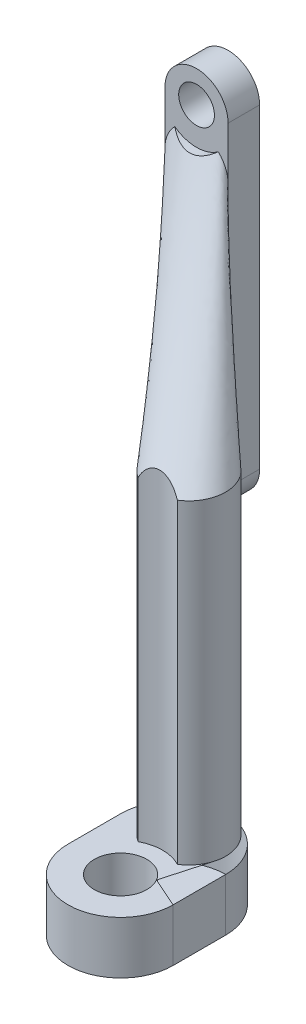
ISO-10303-21;
HEADER;
FILE_DESCRIPTION(('STEP AP214'),'2;1');
FILE_NAME('part.step','',(''),(''),'','','');
FILE_SCHEMA(('AUTOMOTIVE_DESIGN { 1 0 10303 214 1 1 1 1 }'));
ENDSEC;
DATA;
#1=APPLICATION_CONTEXT('core data for automotive mechanical design processes');
#2=APPLICATION_PROTOCOL_DEFINITION('international standard','automotive_design',2000,#1);
#3=PRODUCT_CONTEXT('',#1,'mechanical');
#4=PRODUCT('Part','Part','',(#3));
#5=PRODUCT_RELATED_PRODUCT_CATEGORY('part','',(#4));
#6=PRODUCT_DEFINITION_FORMATION('','',#4);
#7=PRODUCT_DEFINITION_CONTEXT('part definition',#1,'design');
#8=PRODUCT_DEFINITION('design','',#6,#7);
#9=PRODUCT_DEFINITION_SHAPE('','',#8);
#10=(LENGTH_UNIT() NAMED_UNIT(*) SI_UNIT(.MILLI.,.METRE.));
#11=(NAMED_UNIT(*) PLANE_ANGLE_UNIT() SI_UNIT($,.RADIAN.));
#12=(NAMED_UNIT(*) SI_UNIT($,.STERADIAN.) SOLID_ANGLE_UNIT());
#13=UNCERTAINTY_MEASURE_WITH_UNIT(LENGTH_MEASURE(1.E-05),#10,'distance_accuracy_value','');
#14=(GEOMETRIC_REPRESENTATION_CONTEXT(3) GLOBAL_UNCERTAINTY_ASSIGNED_CONTEXT((#13)) GLOBAL_UNIT_ASSIGNED_CONTEXT((#10,
#11,#12)) REPRESENTATION_CONTEXT('',''));
#15=CARTESIAN_POINT('',(0.,0.,0.));
#16=DIRECTION('',(0.,0.,1.));
#17=DIRECTION('',(1.,0.,0.));
#18=AXIS2_PLACEMENT_3D('',#15,#16,#17);
#19=CARTESIAN_POINT('',(0.,35.,-3.));
#20=CARTESIAN_POINT('',(-11.8685601313651,51.0029362070885,-16.1));
#21=CARTESIAN_POINT('',(0.291666666666667,35.,-3.));
#22=CARTESIAN_POINT('',(-11.860815447441,51.2528162180356,-16.1));
#23=CARTESIAN_POINT('',(0.6216,35.,-3.03546666666667));
#24=CARTESIAN_POINT('',(-11.821669251655,51.5345387328538,-16.1));
#25=CARTESIAN_POINT('',(1.3384,35.,-3.24453333333333));
#26=CARTESIAN_POINT('',(-11.6235219245964,52.1430924583206,-16.1));
#27=CARTESIAN_POINT('',(1.72666666666667,35.,-3.42));
#28=CARTESIAN_POINT('',(-11.4628843867709,52.4710735270447,-16.1));
#29=CARTESIAN_POINT('',(2.28666666666667,35.,-3.84));
#30=CARTESIAN_POINT('',(-11.0881873778729,52.9396908032125,-16.1));
#31=CARTESIAN_POINT('',(2.46884969037343,35.,-4.00597360355289));
#32=CARTESIAN_POINT('',(-10.9411550265324,53.091365601586,-16.1));
#33=CARTESIAN_POINT('',(2.8051229123663,35.,-4.39128667041972));
#34=CARTESIAN_POINT('',(-10.6021160670472,53.3692301563681,-16.1));
#35=CARTESIAN_POINT('',(2.95905420991926,35.,-4.61072664359862));
#36=CARTESIAN_POINT('',(-10.4100275682618,53.4952811086598,-16.1));
#37=CARTESIAN_POINT('',(3.21741637831603,35.,-5.09515570934256));
#38=CARTESIAN_POINT('',(-9.9881416016903,53.7037649651266,-16.1));
#39=CARTESIAN_POINT('',(3.32161735700197,35.,-5.36011834319527));
#40=CARTESIAN_POINT('',(-9.75837290628854,53.7860016160199,-16.1));
#41=CARTESIAN_POINT('',(3.46299802761341,35.,-5.91680473372781));
#42=CARTESIAN_POINT('',(-9.27768804925807,53.8923450790391,-16.1));
#43=CARTESIAN_POINT('',(3.5,35.,-6.20833333333334));
#44=CARTESIAN_POINT('',(-9.02694380385857,53.9163048152891,-16.1));
#45=CARTESIAN_POINT('',(3.5,35.,-6.79166666666667));
#46=CARTESIAN_POINT('',(-8.5271837819644,53.900815447441,-16.1));
#47=CARTESIAN_POINT('',(3.46299802761341,35.,-7.08319526627219));
#48=CARTESIAN_POINT('',(-8.27840457826114,53.861373675588,-16.1));
#49=CARTESIAN_POINT('',(3.32161735700197,35.,-7.63988165680474));
#50=CARTESIAN_POINT('',(-7.8052279402491,53.7254666001838,-16.1));
#51=CARTESIAN_POINT('',(3.21741637831603,35.,-7.90484429065744));
#52=CARTESIAN_POINT('',(-7.58099298412389,53.6291587365988,-16.1));
#53=CARTESIAN_POINT('',(2.95905420991926,35.,-8.38927335640138));
#54=CARTESIAN_POINT('',(-7.17282770325867,53.3949485944327,-16.1));
#55=CARTESIAN_POINT('',(2.8051229123663,35.,-8.60871332958028));
#56=CARTESIAN_POINT('',(-6.98891394215717,53.2572439742606,-16.1));
#57=CARTESIAN_POINT('',(2.46884969037343,35.,-8.99402639644711));
#58=CARTESIAN_POINT('',(-6.66773324427048,52.9589168280635,-16.1));
#59=CARTESIAN_POINT('',(2.28666666666667,35.,-9.16));
#60=CARTESIAN_POINT('',(-6.53037597819806,52.7984277684379,-16.1));
#61=CARTESIAN_POINT('',(1.72666666666667,35.,-9.58));
#62=CARTESIAN_POINT('',(-6.18541855556842,52.3075058025689,-16.1));
#63=CARTESIAN_POINT('',(1.3384,35.,-9.75546666666667));
#64=CARTESIAN_POINT('',(-6.04540046422234,51.9702063301474,-16.1));
#65=CARTESIAN_POINT('',(0.6216,35.,-9.96453333333333));
#66=CARTESIAN_POINT('',(-5.8853198075872,51.3505498258071,-16.1));
#67=CARTESIAN_POINT('',(0.291666666666668,35.,-10.));
#68=CARTESIAN_POINT('',(-5.86369518471091,51.0669438038586,-16.1));
#69=CARTESIAN_POINT('',(-0.291666666666667,35.,-10.));
#70=CARTESIAN_POINT('',(-5.87918455255899,50.5671837819644,-16.1));
#71=CARTESIAN_POINT('',(-0.6216,35.,-9.96453333333334));
#72=CARTESIAN_POINT('',(-5.91833074834504,50.2854612671462,-16.1));
#73=CARTESIAN_POINT('',(-1.3384,35.,-9.75546666666667));
#74=CARTESIAN_POINT('',(-6.11647807540364,49.6769075416794,-16.1));
#75=CARTESIAN_POINT('',(-1.72666666666667,35.,-9.58000000000001));
#76=CARTESIAN_POINT('',(-6.2771156132291,49.3489264729554,-16.1));
#77=CARTESIAN_POINT('',(-2.28666666666667,35.,-9.16));
#78=CARTESIAN_POINT('',(-6.65181262212706,48.8803091967876,-16.1));
#79=CARTESIAN_POINT('',(-2.46884969037343,35.,-8.99402639644711));
#80=CARTESIAN_POINT('',(-6.79884497346761,48.728634398414,-16.1));
#81=CARTESIAN_POINT('',(-2.8051229123663,35.,-8.60871332958028));
#82=CARTESIAN_POINT('',(-7.13788393295284,48.4507698436319,-16.1));
#83=CARTESIAN_POINT('',(-2.95905420991926,35.,-8.38927335640138));
#84=CARTESIAN_POINT('',(-7.32997243173824,48.3247188913402,-16.1));
#85=CARTESIAN_POINT('',(-3.21741637831603,35.,-7.90484429065744));
#86=CARTESIAN_POINT('',(-7.75185839830971,48.1162350348734,-16.1));
#87=CARTESIAN_POINT('',(-3.32161735700197,35.,-7.63988165680473));
#88=CARTESIAN_POINT('',(-7.98162709371148,48.0339983839801,-16.1));
#89=CARTESIAN_POINT('',(-3.46299802761341,35.,-7.08319526627219));
#90=CARTESIAN_POINT('',(-8.46231195074195,47.9276549209609,-16.1));
#91=CARTESIAN_POINT('',(-3.5,35.,-6.79166666666666));
#92=CARTESIAN_POINT('',(-8.71305619614145,47.9036951847109,-16.1));
#93=CARTESIAN_POINT('',(-3.5,35.,-6.20833333333333));
#94=CARTESIAN_POINT('',(-9.21281621803562,47.919184552559,-16.1));
#95=CARTESIAN_POINT('',(-3.46299802761341,35.,-5.91680473372781));
#96=CARTESIAN_POINT('',(-9.46159542173887,47.958626324412,-16.1));
#97=CARTESIAN_POINT('',(-3.32161735700197,35.,-5.36011834319527));
#98=CARTESIAN_POINT('',(-9.93477205975092,48.0945333998162,-16.1));
#99=CARTESIAN_POINT('',(-3.21741637831603,35.,-5.09515570934256));
#100=CARTESIAN_POINT('',(-10.1590070158761,48.1908412634012,-16.1));
#101=CARTESIAN_POINT('',(-2.95905420991926,35.,-4.61072664359862));
#102=CARTESIAN_POINT('',(-10.5671722967413,48.4250514055673,-16.1));
#103=CARTESIAN_POINT('',(-2.8051229123663,35.,-4.39128667041972));
#104=CARTESIAN_POINT('',(-10.7510860578428,48.5627560257394,-16.1));
#105=CARTESIAN_POINT('',(-2.46884969037343,35.,-4.00597360355289));
#106=CARTESIAN_POINT('',(-11.0722667557295,48.8610831719365,-16.1));
#107=CARTESIAN_POINT('',(-2.28666666666667,35.,-3.84));
#108=CARTESIAN_POINT('',(-11.209624021802,49.0215722315621,-16.1));
#109=CARTESIAN_POINT('',(-1.72666666666667,35.,-3.42));
#110=CARTESIAN_POINT('',(-11.5545814444316,49.5124941974312,-16.1));
#111=CARTESIAN_POINT('',(-1.3384,35.,-3.24453333333334));
#112=CARTESIAN_POINT('',(-11.6945995357777,49.8497936698526,-16.1));
#113=CARTESIAN_POINT('',(-0.621600000000001,35.,-3.03546666666667));
#114=CARTESIAN_POINT('',(-11.8546801924128,50.4694501741929,-16.1));
#115=CARTESIAN_POINT('',(-0.291666666666666,35.,-3.));
#116=CARTESIAN_POINT('',(-11.8763048152891,50.7530561961414,-16.1));
#117=CARTESIAN_POINT('',(0.,35.,-3.));
#118=CARTESIAN_POINT('',(-11.8685601313651,51.0029362070885,-16.1));
#119=B_SPLINE_SURFACE_WITH_KNOTS('',3,1,((#19,#20),(#21,#22),(#23,#24),(#25,#26),(#27,#28),(#29,
#30),(#31,#32),(#33,#34),(#35,#36),(#37,#38),(#39,#40),(#41,#42),(#43,#44),(#45,#46),(#47,#48),
(#49,#50),(#51,#52),(#53,#54),(#55,#56),(#57,#58),(#59,#60),(#61,#62),(#63,#64),(#65,#66),(#67,
#68),(#69,#70),(#71,#72),(#73,#74),(#75,#76),(#77,#78),(#79,#80),(#81,#82),(#83,#84),(#85,#86),
(#87,#88),(#89,#90),(#91,#92),(#93,#94),(#95,#96),(#97,#98),(#99,#100),(#101,#102),(#103,#104),
(#105,#106),(#107,#108),(#109,#110),(#111,#112),(#113,#114),(#115,#116),(#117,#118)),
.UNSPECIFIED.,.T.,.F.,.F.,(4,2,2,2,2,2,2,2,2,2,2,2,2,2,2,2,2,2,2,2,2,2,2,2,4),(2,2),(0.,0.0625,
0.125,0.15625,0.1875,0.21875,0.25,0.28125,0.3125,0.34375,0.375,0.4375,0.5,0.5625,0.625,0.65625,
0.6875,0.71875,0.75,0.78125,0.8125,0.84375,0.875,0.9375,1.),(0.,1.),.UNSPECIFIED.);
#120=CARTESIAN_POINT('',(0.,35.,-3.));
#121=CARTESIAN_POINT('',(0.291666666666667,35.,-3.));
#122=CARTESIAN_POINT('',(0.6216,35.,-3.03546666666667));
#123=CARTESIAN_POINT('',(1.3384,35.,-3.24453333333333));
#124=CARTESIAN_POINT('',(1.72666666666667,35.,-3.42));
#125=CARTESIAN_POINT('',(2.28666666666667,35.,-3.84));
#126=CARTESIAN_POINT('',(2.46884969037343,35.,-4.00597360355289));
#127=CARTESIAN_POINT('',(2.8051229123663,35.,-4.39128667041972));
#128=CARTESIAN_POINT('',(2.95905420991926,35.,-4.61072664359862));
#129=CARTESIAN_POINT('',(3.21741637831603,35.,-5.09515570934256));
#130=CARTESIAN_POINT('',(3.32161735700197,35.,-5.36011834319527));
#131=CARTESIAN_POINT('',(3.46299802761341,35.,-5.91680473372781));
#132=CARTESIAN_POINT('',(3.5,35.,-6.20833333333334));
#133=CARTESIAN_POINT('',(3.5,35.,-6.79166666666667));
#134=CARTESIAN_POINT('',(3.46299802761341,35.,-7.08319526627219));
#135=CARTESIAN_POINT('',(3.32161735700197,35.,-7.63988165680474));
#136=CARTESIAN_POINT('',(3.21741637831603,35.,-7.90484429065744));
#137=CARTESIAN_POINT('',(2.95905420991926,35.,-8.38927335640138));
#138=CARTESIAN_POINT('',(2.8051229123663,35.,-8.60871332958028));
#139=CARTESIAN_POINT('',(2.46884969037343,35.,-8.99402639644711));
#140=CARTESIAN_POINT('',(2.28666666666667,35.,-9.16));
#141=CARTESIAN_POINT('',(1.72666666666667,35.,-9.58));
#142=CARTESIAN_POINT('',(1.3384,35.,-9.75546666666667));
#143=CARTESIAN_POINT('',(0.6216,35.,-9.96453333333333));
#144=CARTESIAN_POINT('',(0.291666666666668,35.,-10.));
#145=CARTESIAN_POINT('',(-0.291666666666667,35.,-10.));
#146=CARTESIAN_POINT('',(-0.6216,35.,-9.96453333333334));
#147=CARTESIAN_POINT('',(-1.3384,35.,-9.75546666666667));
#148=CARTESIAN_POINT('',(-1.72666666666667,35.,-9.58000000000001));
#149=CARTESIAN_POINT('',(-2.28666666666667,35.,-9.16));
#150=CARTESIAN_POINT('',(-2.46884969037343,35.,-8.99402639644711));
#151=CARTESIAN_POINT('',(-2.8051229123663,35.,-8.60871332958028));
#152=CARTESIAN_POINT('',(-2.95905420991926,35.,-8.38927335640138));
#153=CARTESIAN_POINT('',(-3.21741637831603,35.,-7.90484429065744));
#154=CARTESIAN_POINT('',(-3.32161735700197,35.,-7.63988165680473));
#155=CARTESIAN_POINT('',(-3.46299802761341,35.,-7.08319526627219));
#156=CARTESIAN_POINT('',(-3.5,35.,-6.79166666666666));
#157=CARTESIAN_POINT('',(-3.5,35.,-6.20833333333333));
#158=CARTESIAN_POINT('',(-3.46299802761341,35.,-5.91680473372781));
#159=CARTESIAN_POINT('',(-3.32161735700197,35.,-5.36011834319527));
#160=CARTESIAN_POINT('',(-3.21741637831603,35.,-5.09515570934256));
#161=CARTESIAN_POINT('',(-2.95905420991926,35.,-4.61072664359862));
#162=CARTESIAN_POINT('',(-2.8051229123663,35.,-4.39128667041972));
#163=CARTESIAN_POINT('',(-2.46884969037343,35.,-4.00597360355289));
#164=CARTESIAN_POINT('',(-2.28666666666667,35.,-3.84));
#165=CARTESIAN_POINT('',(-1.72666666666667,35.,-3.42));
#166=CARTESIAN_POINT('',(-1.3384,35.,-3.24453333333334));
#167=CARTESIAN_POINT('',(-0.621600000000001,35.,-3.03546666666667));
#168=CARTESIAN_POINT('',(-0.291666666666666,35.,-3.));
#169=CARTESIAN_POINT('',(0.,35.,-3.));
#170=B_SPLINE_CURVE_WITH_KNOTS('',3,(#120,#121,#122,#123,#124,#125,#126,#127,#128,#129,#130,
#131,#132,#133,#134,#135,#136,#137,#138,#139,#140,#141,#142,#143,#144,#145,#146,#147,#148,#149,
#150,#151,#152,#153,#154,#155,#156,#157,#158,#159,#160,#161,#162,#163,#164,#165,#166,#167,#168,
#169),.UNSPECIFIED.,.T.,.F.,(4,2,2,2,2,2,2,2,2,2,2,2,2,2,2,2,2,2,2,2,2,2,2,2,4),(0.,0.0625,
0.125,0.15625,0.1875,0.21875,0.25,0.28125,0.3125,0.34375,0.375,0.4375,0.5,0.5625,0.625,0.65625,
0.6875,0.71875,0.75,0.78125,0.8125,0.84375,0.875,0.9375,1.),.UNSPECIFIED.);
#171=CARTESIAN_POINT('',(1.86532086676922,35.,-3.53844288914715));
#172=VERTEX_POINT('',#171);
#173=CARTESIAN_POINT('',(-1.8653208667288,35.,-3.53844288912169));
#174=VERTEX_POINT('',#173);
#175=EDGE_CURVE('E215',#172,#174,#170,.T.);
#176=CARTESIAN_POINT('',(-1.86533265711893,35.,-3.53843667150984));
#177=CARTESIAN_POINT('',(-1.84481719014947,35.0524092507256,-3.54924442563767));
#178=CARTESIAN_POINT('',(-1.82286086459141,35.1041664244547,-3.56059785726975));
#179=CARTESIAN_POINT('',(-1.7758082673736,35.2060938369934,-3.58430105895024));
#180=CARTESIAN_POINT('',(-1.75070727433068,35.2562615444267,-3.59665231701209));
#181=CARTESIAN_POINT('',(-1.69687395077032,35.3551058564861,-3.62236310889891));
#182=CARTESIAN_POINT('',(-1.66810474788948,35.4037600182826,-3.63573223085116));
#183=CARTESIAN_POINT('',(-1.60695117487787,35.4985079373185,-3.66317239254266));
#184=CARTESIAN_POINT('',(-1.57456894561993,35.5446031868261,-3.67724301390775));
#185=CARTESIAN_POINT('',(-1.513239331696,35.624244834112,-3.70283171856929));
#186=CARTESIAN_POINT('',(-1.48501843218327,35.6583803690841,-3.71425878687575));
#187=CARTESIAN_POINT('',(-1.42613664241365,35.7244511026776,-3.73726294584616));
#188=CARTESIAN_POINT('',(-1.39547513206235,35.7563857382387,-3.74884007400682));
#189=CARTESIAN_POINT('',(-1.33176061484261,35.8175761840634,-3.7719434754208));
#190=CARTESIAN_POINT('',(-1.29871564688938,35.8468403085036,-3.7834697922033));
#191=CARTESIAN_POINT('',(-1.2301597490733,35.9023829557688,-3.80631210407038));
#192=CARTESIAN_POINT('',(-1.19465013752897,35.9286630551952,-3.81762820755217));
#193=CARTESIAN_POINT('',(-1.1207974837395,35.9781633759055,-3.83996295682916));
#194=CARTESIAN_POINT('',(-1.08242564457401,36.0013432633857,-3.85097642966617));
#195=CARTESIAN_POINT('',(-1.00346201156127,36.043909345464,-3.87230478287128));
#196=CARTESIAN_POINT('',(-0.962870047583466,36.0632952488024,-3.88261960956542));
#197=CARTESIAN_POINT('',(-0.838236685320265,36.1153758992007,-3.91210776687418));
#198=CARTESIAN_POINT('',(-0.751220327008633,36.1420729459702,-3.92986144814758));
#199=CARTESIAN_POINT('',(-0.585226484434286,36.1756222226104,-3.95772739050471));
#200=CARTESIAN_POINT('',(-0.506800918294037,36.1847078476118,-3.9685567751592));
#201=CARTESIAN_POINT('',(-0.349010852204659,36.1906523116189,-3.98553564429573));
#202=CARTESIAN_POINT('',(-0.269646032008739,36.1875068531541,-3.99168348297882));
#203=CARTESIAN_POINT('',(-0.0848541712912146,36.1677416392108,-4.00050365784695));
#204=CARTESIAN_POINT('',(0.0201933040414194,36.1468775649897,-4.00126557212129));
#205=CARTESIAN_POINT('',(0.226091921802624,36.0906320384996,-3.99494252160996));
#206=CARTESIAN_POINT('',(0.326932689335382,36.0552167904758,-3.98783922398346));
#207=CARTESIAN_POINT('',(0.504123697259104,35.9816575544768,-3.96890105392177));
#208=CARTESIAN_POINT('',(0.581411392699228,35.9453964862325,-3.95826082338113));
#209=CARTESIAN_POINT('',(0.732594082455086,35.8674741151045,-3.93308821313626));
#210=CARTESIAN_POINT('',(0.806486676152494,35.8258090683818,-3.91855312759134));
#211=CARTESIAN_POINT('',(0.951158802436964,35.7381596251254,-3.8859764824069));
#212=CARTESIAN_POINT('',(1.02192776255976,35.6921619985227,-3.86792398999813));
#213=CARTESIAN_POINT('',(1.16026853849044,35.5968915207666,-3.8286999000943));
#214=CARTESIAN_POINT('',(1.22784126032535,35.5476196074045,-3.80752919359448));
#215=CARTESIAN_POINT('',(1.39628793362681,35.4187479732561,-3.74994532545496));
#216=CARTESIAN_POINT('',(1.49510210886592,35.3373347472031,-3.7115401685248));
#217=CARTESIAN_POINT('',(1.63799130129321,35.2124343565274,-3.64960801446047));
#218=CARTESIAN_POINT('',(1.6845132631368,35.1705532473493,-3.62835982929395));
#219=CARTESIAN_POINT('',(1.77603865156752,35.0859056798256,-3.58444686773978));
#220=CARTESIAN_POINT('',(1.82104241436108,35.043139420927,-3.56178240820063));
#221=CARTESIAN_POINT('',(1.86533265711893,35.,-3.53843667150984));
#222=B_SPLINE_CURVE_WITH_KNOTS('',3,(#176,#177,#178,#179,#180,#181,#182,#183,#184,#185,#186,
#187,#188,#189,#190,#191,#192,#193,#194,#195,#196,#197,#198,#199,#200,#201,#202,#203,#204,#205,
#206,#207,#208,#209,#210,#211,#212,#213,#214,#215,#216,#217,#218,#219,#220,#221),.UNSPECIFIED.,
.F.,.F.,(4,2,2,2,2,2,2,2,2,2,2,2,2,2,2,2,2,2,2,2,2,2,4),(0.,0.171938943901204,0.344139201035917,
0.518231696603077,0.69222157732816,0.829337684538003,0.96648874119563,1.10319709161468,
1.23983287311156,1.37810202258724,1.51638178266362,1.79250930470599,2.03045972602679,
2.2684937603235,2.58801983905873,2.90829226451946,3.16603124264454,3.42394974397792,
3.68268307536523,3.9413426194701,4.34185218064507,4.54013779191752,4.73837920051509),.UNSPECIFIED.);
#223=EDGE_CURVE('E12',#174,#172,#222,.T.);
#224=CARTESIAN_POINT('',(-8.87000000000001,50.91,-16.1));
#225=DIRECTION('',(0.,0.,1.));
#226=DIRECTION('',(1.,0.,0.));
#227=AXIS2_PLACEMENT_3D('',#224,#225,#226);
#228=CIRCLE('',#227,3.);
#229=CARTESIAN_POINT('',(-5.86999236584811,50.9099999912919,-16.1));
#230=VERTEX_POINT('',#229);
#231=CARTESIAN_POINT('',(-6.80375454635271,53.0849993049682,-16.1));
#232=VERTEX_POINT('',#231);
#233=EDGE_CURVE('E156',#230,#232,#228,.T.);
#234=CARTESIAN_POINT('',(-6.80375393846894,53.0849996082819,-16.1));
#235=CARTESIAN_POINT('',(-6.81771503545325,53.0747869392813,-16.0813379737608));
#236=CARTESIAN_POINT('',(-6.83212839363146,53.0644049729173,-16.0631192144199));
#237=CARTESIAN_POINT('',(-6.86176149091366,53.0434156759952,-16.0275057266978));
#238=CARTESIAN_POINT('',(-6.87698074306806,53.0328084837961,-16.0101105124707));
#239=CARTESIAN_POINT('',(-6.92372809679891,53.000798721308,-15.9590319051729));
#240=CARTESIAN_POINT('',(-6.95634407895866,52.9792092309773,-15.9264577953817));
#241=CARTESIAN_POINT('',(-7.03387097132519,52.9298478070885,-15.8549790633534));
#242=CARTESIAN_POINT('',(-7.07961089444825,52.9020924210494,-15.8169657393414));
#243=CARTESIAN_POINT('',(-7.17471775586854,52.8474796487775,-15.7450039848652));
#244=CARTESIAN_POINT('',(-7.22408689855701,52.8206228229832,-15.7110580584139));
#245=CARTESIAN_POINT('',(-7.32623018708591,52.7683320849107,-15.6470377606634));
#246=CARTESIAN_POINT('',(-7.37901392357966,52.742902591524,-15.6169750738715));
#247=CARTESIAN_POINT('',(-7.48757482013436,52.6940332732677,-15.5609461734214));
#248=CARTESIAN_POINT('',(-7.54335132640024,52.6705930166984,-15.5349790698931));
#249=CARTESIAN_POINT('',(-7.65790512918142,52.626004392605,-15.4870093989191));
#250=CARTESIAN_POINT('',(-7.71669813377786,52.6048703029243,-15.4650310259464));
#251=CARTESIAN_POINT('',(-7.83667803973828,52.5654172039448,-15.425417444784));
#252=CARTESIAN_POINT('',(-7.89786585883033,52.5470992873624,-15.4077839208678));
#253=CARTESIAN_POINT('',(-8.02208156964048,52.5136545522887,-15.3770452445626));
#254=CARTESIAN_POINT('',(-8.08510551650148,52.4985213950321,-15.3639310632977));
#255=CARTESIAN_POINT('',(-8.21263745035589,52.4716687791158,-15.3421968565478));
#256=CARTESIAN_POINT('',(-8.27714542052202,52.4599492817691,-15.3335767801304));
#257=CARTESIAN_POINT('',(-8.40516477552591,52.4404194789424,-15.3210413361549));
#258=CARTESIAN_POINT('',(-8.46864621212779,52.432500481463,-15.3169900178994));
#259=CARTESIAN_POINT('',(-8.5960579348055,52.4201488376567,-15.3130717965961));
#260=CARTESIAN_POINT('',(-8.65998820885159,52.4157160982482,-15.3132047818256));
#261=CARTESIAN_POINT('',(-8.85177426705359,52.4077176153668,-15.319607438771));
#262=CARTESIAN_POINT('',(-8.97972276189448,52.4094367568645,-15.3318718473217));
#263=CARTESIAN_POINT('',(-9.23439115791938,52.4266372978372,-15.3706512490254));
#264=CARTESIAN_POINT('',(-9.36106033305457,52.442334077245,-15.3973866865076));
#265=CARTESIAN_POINT('',(-9.60931450092951,52.4866443778947,-15.4626435221875));
#266=CARTESIAN_POINT('',(-9.73088338456648,52.5152958854533,-15.5011994731057));
#267=CARTESIAN_POINT('',(-9.95067542769527,52.579331058154,-15.5812468427695));
#268=CARTESIAN_POINT('',(-10.0497814726792,52.6132068448311,-15.6215680557962));
#269=CARTESIAN_POINT('',(-10.2427645046389,52.6887789606088,-15.7073866883106));
#270=CARTESIAN_POINT('',(-10.3366349452369,52.7304848078118,-15.7528903807768));
#271=CARTESIAN_POINT('',(-10.5180942788431,52.820666628079,-15.8473077859008));
#272=CARTESIAN_POINT('',(-10.605727234599,52.8690860537779,-15.8961914634834));
#273=CARTESIAN_POINT('',(-10.7752378112649,52.9723377131488,-15.9964648004832));
#274=CARTESIAN_POINT('',(-10.8571297220874,53.0271530487323,-16.0478476563496));
#275=CARTESIAN_POINT('',(-10.9362342676568,53.0849909821106,-16.1));
#276=B_SPLINE_CURVE_WITH_KNOTS('',3,(#234,#235,#236,#237,#238,#239,#240,#241,#242,#243,#244,
#245,#246,#247,#248,#249,#250,#251,#252,#253,#254,#255,#256,#257,#258,#259,#260,#261,#262,#263,
#264,#265,#266,#267,#268,#269,#270,#271,#272,#273,#274,#275),.UNSPECIFIED.,.F.,.F.,(4,2,2,2,2,2,
2,2,2,2,2,2,2,2,2,2,2,2,2,2,4),(0.,0.0763144272085123,0.15258325734891,0.305130182709495,
0.501765538636364,0.698521333942565,0.89585601271886,1.0931477562589,1.29159889157857,
1.49012683554795,1.68825582341078,1.88638256580213,2.07844387400819,2.27050005409084,
2.65431915987733,3.0441568404317,3.43514510541919,3.77129418422896,4.10785455791186,
4.44173524940211,4.77475298806514),.UNSPECIFIED.);
#277=CARTESIAN_POINT('',(-10.9362471033501,53.0850003702837,-16.1));
#278=VERTEX_POINT('',#277);
#279=EDGE_CURVE('E149',#232,#278,#276,.T.);
#280=CARTESIAN_POINT('',(-11.8700075554198,50.910552241133,-16.1));
#281=VERTEX_POINT('',#280);
#282=EDGE_CURVE('E58',#278,#281,#228,.T.);
#283=EDGE_CURVE('E255',#281,#230,#228,.T.);
#284=ORIENTED_EDGE('',*,*,#175,.T.);
#285=ORIENTED_EDGE('',*,*,#223,.T.);
#286=EDGE_LOOP('',(#284,#285));
#287=FACE_BOUND('',#286,.T.);
#288=ORIENTED_EDGE('',*,*,#233,.T.);
#289=ORIENTED_EDGE('',*,*,#279,.T.);
#290=ORIENTED_EDGE('',*,*,#282,.T.);
#291=ORIENTED_EDGE('',*,*,#283,.T.);
#292=EDGE_LOOP('',(#288,#289,#290,#291));
#293=FACE_BOUND('',#292,.T.);
#294=ADVANCED_FACE('F54',(#287,#293),#119,.T.);
#295=CARTESIAN_POINT('',(0.,35.,-6.5));
#296=DIRECTION('',(0.,-1.,0.));
#297=DIRECTION('',(0.,0.,-1.));
#298=AXIS2_PLACEMENT_3D('',#295,#296,#297);
#299=CYLINDRICAL_SURFACE('',#298,3.5);
#300=DIRECTION('',(0.,-1.,0.));
#301=VECTOR('',#300,1.);
#302=CARTESIAN_POINT('',(-1.86528548507418,25.,-3.53846153846154));
#303=LINE('',#302,#301);
#304=CARTESIAN_POINT('',(-1.86528548507417,5.,-3.53846153846154));
#305=VERTEX_POINT('',#304);
#306=EDGE_CURVE('E163',#174,#305,#303,.T.);
#307=ORIENTED_EDGE('',*,*,#306,.F.);
#308=ORIENTED_EDGE('',*,*,#175,.F.);
#309=DIRECTION('',(0.,-1.,0.));
#310=VECTOR('',#309,1.);
#311=CARTESIAN_POINT('',(1.86528548507418,25.,-3.53846153846154));
#312=LINE('',#311,#310);
#313=CARTESIAN_POINT('',(1.86528548507417,5.,-3.53846153846154));
#314=VERTEX_POINT('',#313);
#315=EDGE_CURVE('E203',#314,#172,#312,.F.);
#316=ORIENTED_EDGE('',*,*,#315,.F.);
#317=CARTESIAN_POINT('',(0.,5.,-6.5));
#318=DIRECTION('',(0.,1.,0.));
#319=DIRECTION('',(0.,0.,1.));
#320=AXIS2_PLACEMENT_3D('',#317,#318,#319);
#321=CIRCLE('',#320,3.5);
#322=CARTESIAN_POINT('',(0.,5.,-10.));
#323=VERTEX_POINT('',#322);
#324=EDGE_CURVE('E256',#314,#323,#321,.T.);
#325=ORIENTED_EDGE('',*,*,#324,.T.);
#326=EDGE_CURVE('E259',#323,#305,#321,.T.);
#327=ORIENTED_EDGE('',*,*,#326,.T.);
#328=EDGE_LOOP('',(#307,#308,#316,#325,#327));
#329=FACE_BOUND('',#328,.T.);
#330=ADVANCED_FACE('F231',(#329),#299,.T.);
#331=CARTESIAN_POINT('',(0.,5.,0.));
#332=DIRECTION('',(0.,-1.,0.));
#333=DIRECTION('',(0.,0.,-1.));
#334=AXIS2_PLACEMENT_3D('',#331,#332,#333);
#335=CYLINDRICAL_SURFACE('',#334,5.);
#336=CARTESIAN_POINT('',(0.,0.,0.));
#337=DIRECTION('',(0.,1.,0.));
#338=DIRECTION('',(0.,0.,1.));
#339=AXIS2_PLACEMENT_3D('',#336,#337,#338);
#340=CIRCLE('',#339,5.);
#341=CARTESIAN_POINT('',(-5.,0.,0.));
#342=VERTEX_POINT('',#341);
#343=CARTESIAN_POINT('',(5.,0.,0.));
#344=VERTEX_POINT('',#343);
#345=EDGE_CURVE('E281',#342,#344,#340,.T.);
#346=ORIENTED_EDGE('',*,*,#345,.T.);
#347=DIRECTION('',(0.,-1.,0.));
#348=VECTOR('',#347,1.);
#349=CARTESIAN_POINT('',(5.,5.,0.));
#350=LINE('',#349,#348);
#351=CARTESIAN_POINT('',(5.,5.,0.));
#352=VERTEX_POINT('',#351);
#353=EDGE_CURVE('E64',#352,#344,#350,.T.);
#354=ORIENTED_EDGE('',*,*,#353,.F.);
#355=CARTESIAN_POINT('',(0.,5.,0.));
#356=DIRECTION('',(0.,1.,0.));
#357=DIRECTION('',(0.,0.,1.));
#358=AXIS2_PLACEMENT_3D('',#355,#356,#357);
#359=CIRCLE('',#358,5.);
#360=CARTESIAN_POINT('',(-5.,5.,0.));
#361=VERTEX_POINT('',#360);
#362=EDGE_CURVE('E268',#361,#352,#359,.T.);
#363=ORIENTED_EDGE('',*,*,#362,.F.);
#364=DIRECTION('',(0.,-1.,0.));
#365=VECTOR('',#364,1.);
#366=CARTESIAN_POINT('',(-5.,5.,0.));
#367=LINE('',#366,#365);
#368=EDGE_CURVE('E280',#361,#342,#367,.T.);
#369=ORIENTED_EDGE('',*,*,#368,.T.);
#370=EDGE_LOOP('',(#346,#354,#363,#369));
#371=FACE_BOUND('',#370,.T.);
#372=ADVANCED_FACE('F56',(#371),#335,.T.);
#373=CARTESIAN_POINT('',(5.,5.,0.));
#374=DIRECTION('',(-1.,0.,0.));
#375=DIRECTION('',(0.,0.,1.));
#376=AXIS2_PLACEMENT_3D('',#373,#374,#375);
#377=PLANE('',#376);
#378=DIRECTION('',(0.,0.,-1.));
#379=VECTOR('',#378,1.);
#380=CARTESIAN_POINT('',(5.,0.,0.));
#381=LINE('',#380,#379);
#382=CARTESIAN_POINT('',(5.,0.,-5.));
#383=VERTEX_POINT('',#382);
#384=EDGE_CURVE('E284',#344,#383,#381,.T.);
#385=ORIENTED_EDGE('',*,*,#384,.T.);
#386=DIRECTION('',(0.,-1.,0.));
#387=VECTOR('',#386,1.);
#388=CARTESIAN_POINT('',(5.,5.,-5.));
#389=LINE('',#388,#387);
#390=CARTESIAN_POINT('',(5.,5.,-5.));
#391=VERTEX_POINT('',#390);
#392=EDGE_CURVE('E294',#391,#383,#389,.T.);
#393=ORIENTED_EDGE('',*,*,#392,.F.);
#394=DIRECTION('',(0.,0.,-1.));
#395=VECTOR('',#394,1.);
#396=CARTESIAN_POINT('',(5.,5.,0.));
#397=LINE('',#396,#395);
#398=EDGE_CURVE('E271',#352,#391,#397,.T.);
#399=ORIENTED_EDGE('',*,*,#398,.F.);
#400=ORIENTED_EDGE('',*,*,#353,.T.);
#401=EDGE_LOOP('',(#385,#393,#399,#400));
#402=FACE_BOUND('',#401,.T.);
#403=ADVANCED_FACE('F333',(#402),#377,.F.);
#404=CARTESIAN_POINT('',(0.,5.,-5.));
#405=DIRECTION('',(0.,-1.,0.));
#406=DIRECTION('',(0.,0.,-1.));
#407=AXIS2_PLACEMENT_3D('',#404,#405,#406);
#408=CYLINDRICAL_SURFACE('',#407,5.);
#409=CARTESIAN_POINT('',(0.,0.,-5.));
#410=DIRECTION('',(0.,1.,0.));
#411=DIRECTION('',(0.,0.,1.));
#412=AXIS2_PLACEMENT_3D('',#409,#410,#411);
#413=CIRCLE('',#412,5.);
#414=CARTESIAN_POINT('',(-5.,0.,-5.));
#415=VERTEX_POINT('',#414);
#416=EDGE_CURVE('E286',#383,#415,#413,.T.);
#417=ORIENTED_EDGE('',*,*,#416,.T.);
#418=DIRECTION('',(0.,-1.,0.));
#419=VECTOR('',#418,1.);
#420=CARTESIAN_POINT('',(-5.,5.,-5.));
#421=LINE('',#420,#419);
#422=CARTESIAN_POINT('',(-5.,5.,-5.));
#423=VERTEX_POINT('',#422);
#424=EDGE_CURVE('E291',#423,#415,#421,.T.);
#425=ORIENTED_EDGE('',*,*,#424,.F.);
#426=CARTESIAN_POINT('',(0.,5.,-5.));
#427=DIRECTION('',(0.,1.,0.));
#428=DIRECTION('',(0.,0.,1.));
#429=AXIS2_PLACEMENT_3D('',#426,#427,#428);
#430=CIRCLE('',#429,5.);
#431=EDGE_CURVE('E274',#323,#423,#430,.T.);
#432=ORIENTED_EDGE('',*,*,#431,.F.);
#433=EDGE_CURVE('E275',#391,#323,#430,.T.);
#434=ORIENTED_EDGE('',*,*,#433,.F.);
#435=ORIENTED_EDGE('',*,*,#392,.T.);
#436=EDGE_LOOP('',(#417,#425,#432,#434,#435));
#437=FACE_BOUND('',#436,.T.);
#438=ADVANCED_FACE('F322',(#437),#408,.T.);
#439=CARTESIAN_POINT('',(-5.,5.,0.));
#440=DIRECTION('',(1.,0.,0.));
#441=DIRECTION('',(0.,0.,-1.));
#442=AXIS2_PLACEMENT_3D('',#439,#440,#441);
#443=PLANE('',#442);
#444=DIRECTION('',(0.,0.,1.));
#445=VECTOR('',#444,1.);
#446=CARTESIAN_POINT('',(-5.,0.,0.));
#447=LINE('',#446,#445);
#448=EDGE_CURVE('E272',#415,#342,#447,.T.);
#449=ORIENTED_EDGE('',*,*,#448,.T.);
#450=ORIENTED_EDGE('',*,*,#368,.F.);
#451=DIRECTION('',(0.,0.,1.));
#452=VECTOR('',#451,1.);
#453=CARTESIAN_POINT('',(-5.,5.,0.));
#454=LINE('',#453,#452);
#455=EDGE_CURVE('E278',#423,#361,#454,.T.);
#456=ORIENTED_EDGE('',*,*,#455,.F.);
#457=ORIENTED_EDGE('',*,*,#424,.T.);
#458=EDGE_LOOP('',(#449,#450,#456,#457));
#459=FACE_BOUND('',#458,.T.);
#460=ADVANCED_FACE('F328',(#459),#443,.F.);
#461=CARTESIAN_POINT('',(0.,5.,0.));
#462=DIRECTION('',(0.,1.,0.));
#463=DIRECTION('',(0.,0.,1.));
#464=AXIS2_PLACEMENT_3D('',#461,#462,#463);
#465=PLANE('',#464);
#466=ORIENTED_EDGE('',*,*,#324,.F.);
#467=CARTESIAN_POINT('',(0.,5.,0.));
#468=DIRECTION('',(0.,1.,0.));
#469=DIRECTION('',(0.,0.,1.));
#470=AXIS2_PLACEMENT_3D('',#467,#468,#469);
#471=CIRCLE('',#470,4.);
#472=EDGE_CURVE('E195',#314,#305,#471,.T.);
#473=ORIENTED_EDGE('',*,*,#472,.T.);
#474=ORIENTED_EDGE('',*,*,#326,.F.);
#475=ORIENTED_EDGE('',*,*,#431,.T.);
#476=ORIENTED_EDGE('',*,*,#455,.T.);
#477=ORIENTED_EDGE('',*,*,#362,.T.);
#478=ORIENTED_EDGE('',*,*,#398,.T.);
#479=ORIENTED_EDGE('',*,*,#433,.T.);
#480=EDGE_LOOP('',(#466,#473,#474,#475,#476,#477,#478,#479));
#481=FACE_BOUND('',#480,.T.);
#482=CARTESIAN_POINT('',(0.,5.,0.));
#483=DIRECTION('',(0.,1.,0.));
#484=DIRECTION('',(0.,0.,1.));
#485=AXIS2_PLACEMENT_3D('',#482,#483,#484);
#486=CIRCLE('',#485,2.5);
#487=CARTESIAN_POINT('',(0.,5.,2.5));
#488=VERTEX_POINT('',#487);
#489=EDGE_CURVE('E264',#488,#488,#486,.T.);
#490=ORIENTED_EDGE('',*,*,#489,.F.);
#491=EDGE_LOOP('',(#490));
#492=FACE_BOUND('',#491,.T.);
#493=ADVANCED_FACE('F315',(#481,#492),#465,.T.);
#494=CARTESIAN_POINT('',(0.,0.,0.));
#495=DIRECTION('',(0.,1.,0.));
#496=DIRECTION('',(0.,0.,1.));
#497=AXIS2_PLACEMENT_3D('',#494,#495,#496);
#498=PLANE('',#497);
#499=CARTESIAN_POINT('',(0.,0.,0.));
#500=DIRECTION('',(0.,1.,0.));
#501=DIRECTION('',(0.,0.,1.));
#502=AXIS2_PLACEMENT_3D('',#499,#500,#501);
#503=CIRCLE('',#502,2.5);
#504=CARTESIAN_POINT('',(0.,0.,2.5));
#505=VERTEX_POINT('',#504);
#506=EDGE_CURVE('E267',#505,#505,#503,.T.);
#507=ORIENTED_EDGE('',*,*,#506,.T.);
#508=EDGE_LOOP('',(#507));
#509=FACE_BOUND('',#508,.T.);
#510=ORIENTED_EDGE('',*,*,#345,.F.);
#511=ORIENTED_EDGE('',*,*,#448,.F.);
#512=ORIENTED_EDGE('',*,*,#416,.F.);
#513=ORIENTED_EDGE('',*,*,#384,.F.);
#514=EDGE_LOOP('',(#510,#511,#512,#513));
#515=FACE_BOUND('',#514,.T.);
#516=ADVANCED_FACE('F336',(#509,#515),#498,.F.);
#517=CARTESIAN_POINT('',(0.,-5.,0.));
#518=DIRECTION('',(0.,1.,0.));
#519=DIRECTION('',(0.,0.,1.));
#520=AXIS2_PLACEMENT_3D('',#517,#518,#519);
#521=CYLINDRICAL_SURFACE('',#520,2.5);
#522=ORIENTED_EDGE('',*,*,#489,.T.);
#523=EDGE_LOOP('',(#522));
#524=FACE_BOUND('',#523,.T.);
#525=ORIENTED_EDGE('',*,*,#506,.F.);
#526=EDGE_LOOP('',(#525));
#527=FACE_BOUND('',#526,.T.);
#528=ADVANCED_FACE('F338',(#524,#527),#521,.F.);
#529=CARTESIAN_POINT('',(0.,45.,0.));
#530=DIRECTION('',(0.,-1.,0.));
#531=DIRECTION('',(0.,0.,-1.));
#532=AXIS2_PLACEMENT_3D('',#529,#530,#531);
#533=CYLINDRICAL_SURFACE('',#532,4.);
#534=ORIENTED_EDGE('',*,*,#306,.T.);
#535=ORIENTED_EDGE('',*,*,#472,.F.);
#536=ORIENTED_EDGE('',*,*,#315,.T.);
#537=ORIENTED_EDGE('',*,*,#223,.F.);
#538=EDGE_LOOP('',(#534,#535,#536,#537));
#539=FACE_BOUND('',#538,.T.);
#540=ADVANCED_FACE('F232',(#539),#533,.F.);
#541=CARTESIAN_POINT('',(-8.87,55.91,-16.1));
#542=DIRECTION('',(0.,0.,1.));
#543=DIRECTION('',(1.,0.,0.));
#544=AXIS2_PLACEMENT_3D('',#541,#542,#543);
#545=PLANE('',#544);
#546=CARTESIAN_POINT('',(-8.87,25.91,-16.1));
#547=DIRECTION('',(0.,0.,1.));
#548=DIRECTION('',(1.,0.,0.));
#549=AXIS2_PLACEMENT_3D('',#546,#547,#548);
#550=CIRCLE('',#549,1.7);
#551=CARTESIAN_POINT('',(-7.17,25.91,-16.1));
#552=VERTEX_POINT('',#551);
#553=EDGE_CURVE('E510',#552,#552,#550,.T.);
#554=ORIENTED_EDGE('',*,*,#553,.F.);
#555=EDGE_LOOP('',(#554));
#556=FACE_BOUND('',#555,.T.);
#557=DIRECTION('',(0.,1.,0.));
#558=VECTOR('',#557,1.);
#559=CARTESIAN_POINT('',(-5.87000000000001,55.91,-16.1));
#560=LINE('',#559,#558);
#561=CARTESIAN_POINT('',(-5.87,25.91,-16.1));
#562=VERTEX_POINT('',#561);
#563=EDGE_CURVE('E523',#562,#230,#560,.T.);
#564=ORIENTED_EDGE('',*,*,#563,.T.);
#565=ORIENTED_EDGE('',*,*,#283,.F.);
#566=DIRECTION('',(0.,-1.,0.));
#567=VECTOR('',#566,1.);
#568=CARTESIAN_POINT('',(-11.87,55.91,-16.1));
#569=LINE('',#568,#567);
#570=CARTESIAN_POINT('',(-11.87,25.91,-16.1));
#571=VERTEX_POINT('',#570);
#572=EDGE_CURVE('E534',#281,#571,#569,.T.);
#573=ORIENTED_EDGE('',*,*,#572,.T.);
#574=CARTESIAN_POINT('',(-8.87,25.91,-16.1));
#575=DIRECTION('',(0.,0.,1.));
#576=DIRECTION('',(1.,0.,0.));
#577=AXIS2_PLACEMENT_3D('',#574,#575,#576);
#578=CIRCLE('',#577,3.);
#579=EDGE_CURVE('E537',#571,#562,#578,.T.);
#580=ORIENTED_EDGE('',*,*,#579,.T.);
#581=EDGE_LOOP('',(#564,#565,#573,#580));
#582=FACE_BOUND('',#581,.T.);
#583=ADVANCED_FACE('F187',(#556,#582),#545,.T.);
#584=CARTESIAN_POINT('',(-8.87,55.91,-19.1));
#585=DIRECTION('',(0.,0.,1.));
#586=DIRECTION('',(1.,0.,0.));
#587=AXIS2_PLACEMENT_3D('',#584,#585,#586);
#588=CYLINDRICAL_SURFACE('',#587,3.);
#589=CARTESIAN_POINT('',(-8.87,55.91,-16.1));
#590=DIRECTION('',(0.,0.,1.));
#591=DIRECTION('',(1.,0.,0.));
#592=AXIS2_PLACEMENT_3D('',#589,#590,#591);
#593=CIRCLE('',#592,3.);
#594=CARTESIAN_POINT('',(-5.87000000000001,55.91,-16.1));
#595=VERTEX_POINT('',#594);
#596=CARTESIAN_POINT('',(-11.87,55.91,-16.1));
#597=VERTEX_POINT('',#596);
#598=EDGE_CURVE('E516',#595,#597,#593,.T.);
#599=ORIENTED_EDGE('',*,*,#598,.F.);
#600=DIRECTION('',(0.,0.,1.));
#601=VECTOR('',#600,1.);
#602=CARTESIAN_POINT('',(-5.87000000000001,55.91,-19.1));
#603=LINE('',#602,#601);
#604=CARTESIAN_POINT('',(-5.87000000000001,55.91,-19.1));
#605=VERTEX_POINT('',#604);
#606=EDGE_CURVE('E204',#605,#595,#603,.T.);
#607=ORIENTED_EDGE('',*,*,#606,.F.);
#608=CARTESIAN_POINT('',(-8.87,55.91,-19.1));
#609=DIRECTION('',(0.,0.,1.));
#610=DIRECTION('',(1.,0.,0.));
#611=AXIS2_PLACEMENT_3D('',#608,#609,#610);
#612=CIRCLE('',#611,3.);
#613=CARTESIAN_POINT('',(-11.87,55.91,-19.1));
#614=VERTEX_POINT('',#613);
#615=EDGE_CURVE('E519',#605,#614,#612,.T.);
#616=ORIENTED_EDGE('',*,*,#615,.T.);
#617=DIRECTION('',(0.,0.,1.));
#618=VECTOR('',#617,1.);
#619=CARTESIAN_POINT('',(-11.87,55.91,-19.1));
#620=LINE('',#619,#618);
#621=EDGE_CURVE('E532',#614,#597,#620,.T.);
#622=ORIENTED_EDGE('',*,*,#621,.T.);
#623=EDGE_LOOP('',(#599,#607,#616,#622));
#624=FACE_BOUND('',#623,.T.);
#625=ADVANCED_FACE('F389',(#624),#588,.T.);
#626=CARTESIAN_POINT('',(-5.87000000000001,55.91,-19.1));
#627=DIRECTION('',(1.,0.,0.));
#628=DIRECTION('',(0.,1.,0.));
#629=AXIS2_PLACEMENT_3D('',#626,#627,#628);
#630=PLANE('',#629);
#631=ORIENTED_EDGE('',*,*,#563,.F.);
#632=DIRECTION('',(0.,0.,1.));
#633=VECTOR('',#632,1.);
#634=CARTESIAN_POINT('',(-5.87,25.91,-19.1));
#635=LINE('',#634,#633);
#636=CARTESIAN_POINT('',(-5.87,25.91,-19.1));
#637=VERTEX_POINT('',#636);
#638=EDGE_CURVE('E550',#637,#562,#635,.T.);
#639=ORIENTED_EDGE('',*,*,#638,.F.);
#640=DIRECTION('',(0.,1.,0.));
#641=VECTOR('',#640,1.);
#642=CARTESIAN_POINT('',(-5.87000000000001,55.91,-19.1));
#643=LINE('',#642,#641);
#644=EDGE_CURVE('E529',#637,#605,#643,.T.);
#645=ORIENTED_EDGE('',*,*,#644,.T.);
#646=ORIENTED_EDGE('',*,*,#606,.T.);
#647=EDGE_CURVE('E544',#230,#595,#560,.T.);
#648=ORIENTED_EDGE('',*,*,#647,.F.);
#649=EDGE_LOOP('',(#631,#639,#645,#646,#648));
#650=FACE_BOUND('',#649,.T.);
#651=ADVANCED_FACE('F189',(#650),#630,.T.);
#652=CARTESIAN_POINT('',(-8.87,25.91,-19.1));
#653=DIRECTION('',(0.,0.,1.));
#654=DIRECTION('',(1.,0.,0.));
#655=AXIS2_PLACEMENT_3D('',#652,#653,#654);
#656=CYLINDRICAL_SURFACE('',#655,3.);
#657=ORIENTED_EDGE('',*,*,#579,.F.);
#658=DIRECTION('',(0.,0.,1.));
#659=VECTOR('',#658,1.);
#660=CARTESIAN_POINT('',(-11.87,25.91,-19.1));
#661=LINE('',#660,#659);
#662=CARTESIAN_POINT('',(-11.87,25.91,-19.1));
#663=VERTEX_POINT('',#662);
#664=EDGE_CURVE('E552',#663,#571,#661,.T.);
#665=ORIENTED_EDGE('',*,*,#664,.F.);
#666=CARTESIAN_POINT('',(-8.87,25.91,-19.1));
#667=DIRECTION('',(0.,0.,1.));
#668=DIRECTION('',(1.,0.,0.));
#669=AXIS2_PLACEMENT_3D('',#666,#667,#668);
#670=CIRCLE('',#669,3.);
#671=EDGE_CURVE('E526',#663,#637,#670,.T.);
#672=ORIENTED_EDGE('',*,*,#671,.T.);
#673=ORIENTED_EDGE('',*,*,#638,.T.);
#674=EDGE_LOOP('',(#657,#665,#672,#673));
#675=FACE_BOUND('',#674,.T.);
#676=ADVANCED_FACE('F406',(#675),#656,.T.);
#677=CARTESIAN_POINT('',(-11.87,55.91,-19.1));
#678=DIRECTION('',(-1.,0.,0.));
#679=DIRECTION('',(0.,-1.,0.));
#680=AXIS2_PLACEMENT_3D('',#677,#678,#679);
#681=PLANE('',#680);
#682=EDGE_CURVE('E78',#597,#281,#569,.T.);
#683=ORIENTED_EDGE('',*,*,#682,.F.);
#684=ORIENTED_EDGE('',*,*,#621,.F.);
#685=DIRECTION('',(0.,-1.,0.));
#686=VECTOR('',#685,1.);
#687=CARTESIAN_POINT('',(-11.87,55.91,-19.1));
#688=LINE('',#687,#686);
#689=EDGE_CURVE('E522',#614,#663,#688,.T.);
#690=ORIENTED_EDGE('',*,*,#689,.T.);
#691=ORIENTED_EDGE('',*,*,#664,.T.);
#692=ORIENTED_EDGE('',*,*,#572,.F.);
#693=EDGE_LOOP('',(#683,#684,#690,#691,#692));
#694=FACE_BOUND('',#693,.T.);
#695=ADVANCED_FACE('F411',(#694),#681,.T.);
#696=CARTESIAN_POINT('',(-8.87,55.91,-19.1));
#697=DIRECTION('',(0.,0.,1.));
#698=DIRECTION('',(1.,0.,0.));
#699=AXIS2_PLACEMENT_3D('',#696,#697,#698);
#700=PLANE('',#699);
#701=CARTESIAN_POINT('',(-8.87,55.91,-19.1));
#702=DIRECTION('',(0.,0.,1.));
#703=DIRECTION('',(1.,0.,0.));
#704=AXIS2_PLACEMENT_3D('',#701,#702,#703);
#705=CIRCLE('',#704,1.7);
#706=CARTESIAN_POINT('',(-7.17000000000001,55.91,-19.1));
#707=VERTEX_POINT('',#706);
#708=EDGE_CURVE('E507',#707,#707,#705,.T.);
#709=ORIENTED_EDGE('',*,*,#708,.T.);
#710=EDGE_LOOP('',(#709));
#711=FACE_BOUND('',#710,.T.);
#712=CARTESIAN_POINT('',(-8.87,25.91,-19.1));
#713=DIRECTION('',(0.,0.,1.));
#714=DIRECTION('',(1.,0.,0.));
#715=AXIS2_PLACEMENT_3D('',#712,#713,#714);
#716=CIRCLE('',#715,1.7);
#717=CARTESIAN_POINT('',(-7.17,25.91,-19.1));
#718=VERTEX_POINT('',#717);
#719=EDGE_CURVE('E513',#718,#718,#716,.T.);
#720=ORIENTED_EDGE('',*,*,#719,.T.);
#721=EDGE_LOOP('',(#720));
#722=FACE_BOUND('',#721,.T.);
#723=ORIENTED_EDGE('',*,*,#615,.F.);
#724=ORIENTED_EDGE('',*,*,#644,.F.);
#725=ORIENTED_EDGE('',*,*,#671,.F.);
#726=ORIENTED_EDGE('',*,*,#689,.F.);
#727=EDGE_LOOP('',(#723,#724,#725,#726));
#728=FACE_BOUND('',#727,.T.);
#729=ADVANCED_FACE('F186',(#711,#722,#728),#700,.F.);
#730=ORIENTED_EDGE('',*,*,#282,.F.);
#731=CARTESIAN_POINT('',(-8.87,55.91,-16.1));
#732=DIRECTION('',(0.,0.,1.));
#733=DIRECTION('',(1.,0.,0.));
#734=AXIS2_PLACEMENT_3D('',#731,#732,#733);
#735=CIRCLE('',#734,3.5);
#736=EDGE_CURVE('E72',#278,#232,#735,.T.);
#737=ORIENTED_EDGE('',*,*,#736,.T.);
#738=ORIENTED_EDGE('',*,*,#233,.F.);
#739=ORIENTED_EDGE('',*,*,#647,.T.);
#740=ORIENTED_EDGE('',*,*,#598,.T.);
#741=ORIENTED_EDGE('',*,*,#682,.T.);
#742=EDGE_LOOP('',(#730,#737,#738,#739,#740,#741));
#743=FACE_BOUND('',#742,.T.);
#744=CARTESIAN_POINT('',(-8.87,55.91,-16.1));
#745=DIRECTION('',(0.,0.,1.));
#746=DIRECTION('',(1.,0.,0.));
#747=AXIS2_PLACEMENT_3D('',#744,#745,#746);
#748=CIRCLE('',#747,1.7);
#749=CARTESIAN_POINT('',(-7.17000000000001,55.91,-16.1));
#750=VERTEX_POINT('',#749);
#751=EDGE_CURVE('E158',#750,#750,#748,.T.);
#752=ORIENTED_EDGE('',*,*,#751,.F.);
#753=EDGE_LOOP('',(#752));
#754=FACE_BOUND('',#753,.T.);
#755=ADVANCED_FACE('F161',(#743,#754),#545,.T.);
#756=CARTESIAN_POINT('',(-8.87,25.91,-19.1));
#757=DIRECTION('',(0.,0.,1.));
#758=DIRECTION('',(1.,0.,0.));
#759=AXIS2_PLACEMENT_3D('',#756,#757,#758);
#760=CYLINDRICAL_SURFACE('',#759,1.7);
#761=ORIENTED_EDGE('',*,*,#719,.F.);
#762=EDGE_LOOP('',(#761));
#763=FACE_BOUND('',#762,.T.);
#764=ORIENTED_EDGE('',*,*,#553,.T.);
#765=EDGE_LOOP('',(#764));
#766=FACE_BOUND('',#765,.T.);
#767=ADVANCED_FACE('F185',(#763,#766),#760,.F.);
#768=CARTESIAN_POINT('',(-8.87,55.91,-19.1));
#769=DIRECTION('',(0.,0.,1.));
#770=DIRECTION('',(1.,0.,0.));
#771=AXIS2_PLACEMENT_3D('',#768,#769,#770);
#772=CYLINDRICAL_SURFACE('',#771,1.7);
#773=ORIENTED_EDGE('',*,*,#708,.F.);
#774=EDGE_LOOP('',(#773));
#775=FACE_BOUND('',#774,.T.);
#776=ORIENTED_EDGE('',*,*,#751,.T.);
#777=EDGE_LOOP('',(#776));
#778=FACE_BOUND('',#777,.T.);
#779=ADVANCED_FACE('F433',(#775,#778),#772,.F.);
#780=CARTESIAN_POINT('',(-8.87,55.91,-6.1));
#781=DIRECTION('',(0.,0.,-1.));
#782=DIRECTION('',(-1.,0.,0.));
#783=AXIS2_PLACEMENT_3D('',#780,#781,#782);
#784=CYLINDRICAL_SURFACE('',#783,3.5);
#785=ORIENTED_EDGE('',*,*,#736,.F.);
#786=ORIENTED_EDGE('',*,*,#279,.F.);
#787=EDGE_LOOP('',(#785,#786));
#788=FACE_BOUND('',#787,.T.);
#789=ADVANCED_FACE('F148',(#788),#784,.F.);
#790=CLOSED_SHELL('',(#294,#330,#372,#403,#438,#460,#493,#516,#528,#540,#583,#625,#651,#676,
#695,#729,#755,#767,#779,#789));
#791=MANIFOLD_SOLID_BREP('B2',#790);
#792=ADVANCED_BREP_SHAPE_REPRESENTATION('',(#18,#791),#14);
#793=SHAPE_DEFINITION_REPRESENTATION(#9,#792);
ENDSEC;
END-ISO-10303-21;
